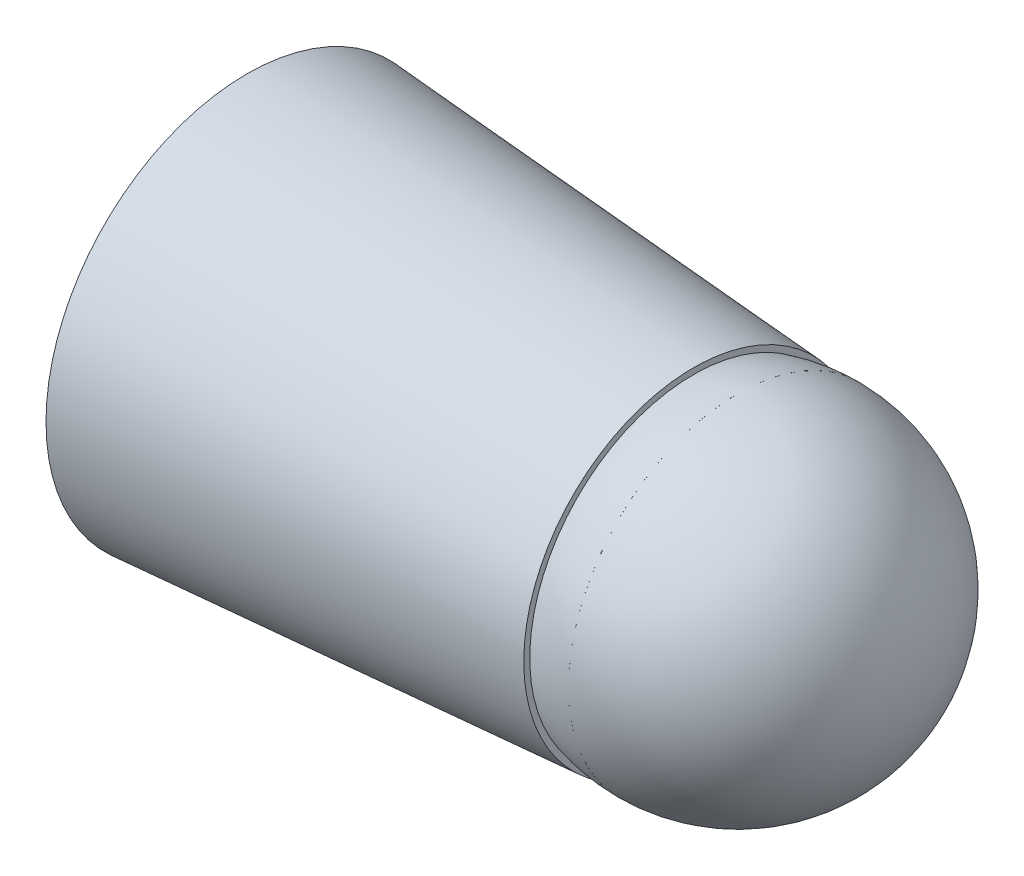
ISO-10303-21;
HEADER;
FILE_DESCRIPTION(('STEP AP214'),'2;1');
FILE_NAME('part.step','',(''),(''),'','','');
FILE_SCHEMA(('AUTOMOTIVE_DESIGN { 1 0 10303 214 1 1 1 1 }'));
ENDSEC;
DATA;
#1=APPLICATION_CONTEXT('core data for automotive mechanical design processes');
#2=APPLICATION_PROTOCOL_DEFINITION('international standard','automotive_design',2000,#1);
#3=PRODUCT_CONTEXT('',#1,'mechanical');
#4=PRODUCT('Part','Part','',(#3));
#5=PRODUCT_RELATED_PRODUCT_CATEGORY('part','',(#4));
#6=PRODUCT_DEFINITION_FORMATION('','',#4);
#7=PRODUCT_DEFINITION_CONTEXT('part definition',#1,'design');
#8=PRODUCT_DEFINITION('design','',#6,#7);
#9=PRODUCT_DEFINITION_SHAPE('','',#8);
#10=(LENGTH_UNIT() NAMED_UNIT(*) SI_UNIT(.MILLI.,.METRE.));
#11=(NAMED_UNIT(*) PLANE_ANGLE_UNIT() SI_UNIT($,.RADIAN.));
#12=(NAMED_UNIT(*) SI_UNIT($,.STERADIAN.) SOLID_ANGLE_UNIT());
#13=UNCERTAINTY_MEASURE_WITH_UNIT(LENGTH_MEASURE(1.E-05),#10,'distance_accuracy_value','');
#14=(GEOMETRIC_REPRESENTATION_CONTEXT(3) GLOBAL_UNCERTAINTY_ASSIGNED_CONTEXT((#13)) GLOBAL_UNIT_ASSIGNED_CONTEXT((#10,
#11,#12)) REPRESENTATION_CONTEXT('',''));
#15=CARTESIAN_POINT('',(0.,0.,0.));
#16=DIRECTION('',(0.,0.,1.));
#17=DIRECTION('',(1.,0.,0.));
#18=AXIS2_PLACEMENT_3D('',#15,#16,#17);
#19=CARTESIAN_POINT('',(11.,0.,0.));
#20=DIRECTION('',(1.,0.,0.));
#21=DIRECTION('',(0.,0.,-1.));
#22=AXIS2_PLACEMENT_3D('',#19,#20,#21);
#23=PLANE('',#22);
#24=CARTESIAN_POINT('',(11.,0.,0.));
#25=DIRECTION('',(1.,0.,0.));
#26=DIRECTION('',(0.,0.,-1.));
#27=AXIS2_PLACEMENT_3D('',#24,#25,#26);
#28=CIRCLE('',#27,3.80073188056489);
#29=CARTESIAN_POINT('',(11.,0.,-3.80073188056489));
#30=VERTEX_POINT('',#29);
#31=EDGE_CURVE('E11',#30,#30,#28,.T.);
#32=ORIENTED_EDGE('',*,*,#31,.T.);
#33=EDGE_LOOP('',(#32));
#34=FACE_BOUND('',#33,.T.);
#35=ADVANCED_FACE('F42',(#34),#23,.T.);
#36=OPEN_SHELL('',(#35));
#37=SHELL_BASED_SURFACE_MODEL('B2',(#36));
#38=CARTESIAN_POINT('',(10.,0.,0.));
#39=DIRECTION('',(1.,0.,0.));
#40=DIRECTION('',(0.,0.,-1.));
#41=AXIS2_PLACEMENT_3D('',#38,#39,#40);
#42=PLANE('',#41);
#43=CARTESIAN_POINT('',(10.,0.,0.));
#44=DIRECTION('',(1.,0.,0.));
#45=DIRECTION('',(0.,0.,-1.));
#46=AXIS2_PLACEMENT_3D('',#43,#44,#45);
#47=CIRCLE('',#46,3.80073188056489);
#48=CARTESIAN_POINT('',(10.,0.,-3.80073188056489));
#49=VERTEX_POINT('',#48);
#50=EDGE_CURVE('E41',#49,#49,#47,.T.);
#51=ORIENTED_EDGE('',*,*,#50,.T.);
#52=EDGE_LOOP('',(#51));
#53=FACE_BOUND('',#52,.T.);
#54=CARTESIAN_POINT('',(10.,0.,0.));
#55=DIRECTION('',(1.,0.,0.));
#56=DIRECTION('',(0.,0.,-1.));
#57=AXIS2_PLACEMENT_3D('',#54,#55,#56);
#58=CIRCLE('',#57,3.66681917033583);
#59=CARTESIAN_POINT('',(10.,0.,-3.66681917033583));
#60=VERTEX_POINT('',#59);
#61=EDGE_CURVE('E62',#60,#60,#58,.F.);
#62=ORIENTED_EDGE('',*,*,#61,.T.);
#63=EDGE_LOOP('',(#62));
#64=FACE_BOUND('',#63,.T.);
#65=ADVANCED_FACE('F58',(#53,#64),#42,.T.);
#66=CARTESIAN_POINT('',(0.,0.,0.));
#67=DIRECTION('',(-1.,0.,0.));
#68=DIRECTION('',(0.,0.,-1.));
#69=AXIS2_PLACEMENT_3D('',#66,#67,#68);
#70=CONICAL_SURFACE('',#69,4.5,0.0698131700797732);
#71=ORIENTED_EDGE('',*,*,#50,.F.);
#72=EDGE_LOOP('',(#71));
#73=FACE_BOUND('',#72,.T.);
#74=CARTESIAN_POINT('',(0.,0.,0.));
#75=DIRECTION('',(1.,0.,0.));
#76=DIRECTION('',(0.,0.,-1.));
#77=AXIS2_PLACEMENT_3D('',#74,#75,#76);
#78=CIRCLE('',#77,4.5);
#79=CARTESIAN_POINT('',(0.,0.,-4.5));
#80=VERTEX_POINT('',#79);
#81=EDGE_CURVE('E66',#80,#80,#78,.T.);
#82=ORIENTED_EDGE('',*,*,#81,.T.);
#83=EDGE_LOOP('',(#82));
#84=FACE_BOUND('',#83,.T.);
#85=ADVANCED_FACE('F60',(#73,#84),#70,.T.);
#86=CARTESIAN_POINT('',(0.,0.,0.));
#87=DIRECTION('',(1.,0.,0.));
#88=DIRECTION('',(0.,0.,-1.));
#89=AXIS2_PLACEMENT_3D('',#86,#87,#88);
#90=PLANE('',#89);
#91=ORIENTED_EDGE('',*,*,#81,.F.);
#92=EDGE_LOOP('',(#91));
#93=FACE_BOUND('',#92,.T.);
#94=ADVANCED_FACE('F79',(#93),#90,.F.);
#95=CARTESIAN_POINT('',(11.,0.,0.));
#96=DIRECTION('',(0.,1.,0.));
#97=DIRECTION('',(0.,0.,-1.));
#98=AXIS2_PLACEMENT_3D('',#95,#96,#97);
#99=SPHERICAL_SURFACE('',#98,3.80073188056489);
#100=CARTESIAN_POINT('',(11.,0.,0.));
#101=DIRECTION('',(1.,0.,0.));
#102=DIRECTION('',(0.,0.,-1.));
#103=AXIS2_PLACEMENT_3D('',#100,#101,#102);
#104=SPHERICAL_SURFACE('',#103,3.80073188056489);
#105=ORIENTED_EDGE('',*,*,#61,.F.);
#106=EDGE_LOOP('',(#105));
#107=FACE_BOUND('',#106,.T.);
#108=ADVANCED_FACE('F77',(#107),#104,.T.);
#109=CLOSED_SHELL('',(#65,#85,#94,#108));
#110=MANIFOLD_SOLID_BREP('B6',#109);
#111=ADVANCED_BREP_SHAPE_REPRESENTATION('',(#18,#110),#14);
#112=MANIFOLD_SURFACE_SHAPE_REPRESENTATION('',(#18,#37),#14);
#113=SHAPE_REPRESENTATION('',(#18),#14);
#114=SHAPE_DEFINITION_REPRESENTATION(#9,#113);
#115=SHAPE_REPRESENTATION_RELATIONSHIP('','',#113,#111);
#116=SHAPE_REPRESENTATION_RELATIONSHIP('','',#113,#112);
ENDSEC;
END-ISO-10303-21;
